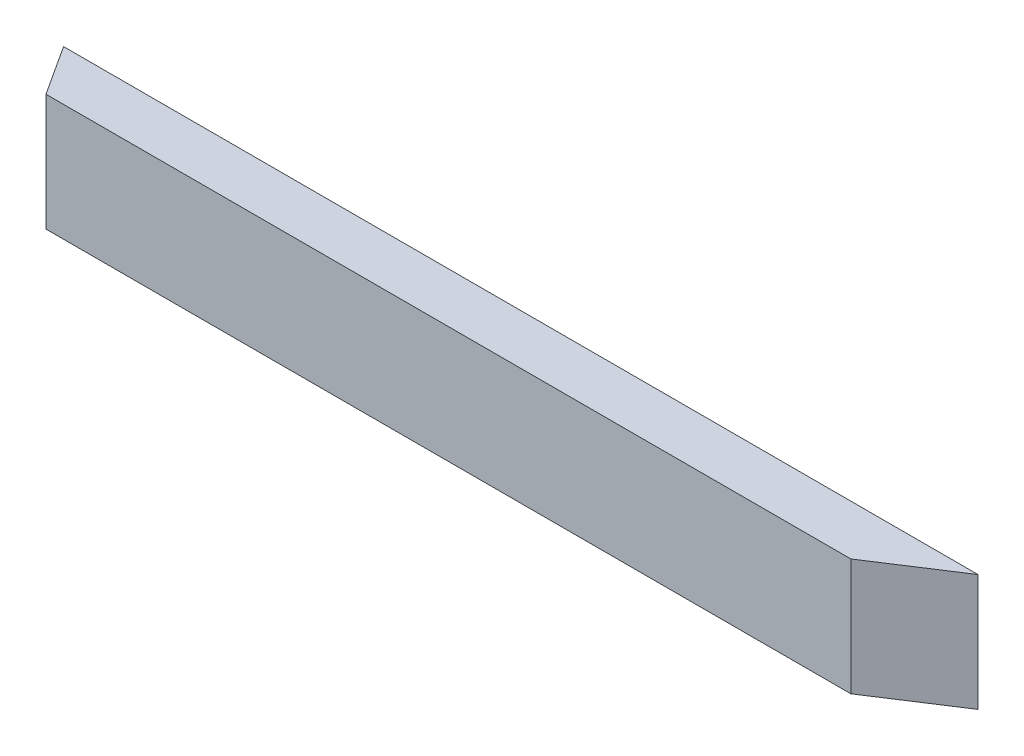
ISO-10303-21;
HEADER;
FILE_DESCRIPTION(('STEP AP214'),'2;1');
FILE_NAME('part.step','',(''),(''),'','','');
FILE_SCHEMA(('AUTOMOTIVE_DESIGN { 1 0 10303 214 1 1 1 1 }'));
ENDSEC;
DATA;
#1=APPLICATION_CONTEXT('core data for automotive mechanical design processes');
#2=APPLICATION_PROTOCOL_DEFINITION('international standard','automotive_design',2000,#1);
#3=PRODUCT_CONTEXT('',#1,'mechanical');
#4=PRODUCT('Part','Part','',(#3));
#5=PRODUCT_RELATED_PRODUCT_CATEGORY('part','',(#4));
#6=PRODUCT_DEFINITION_FORMATION('','',#4);
#7=PRODUCT_DEFINITION_CONTEXT('part definition',#1,'design');
#8=PRODUCT_DEFINITION('design','',#6,#7);
#9=PRODUCT_DEFINITION_SHAPE('','',#8);
#10=(LENGTH_UNIT() NAMED_UNIT(*) SI_UNIT(.MILLI.,.METRE.));
#11=(NAMED_UNIT(*) PLANE_ANGLE_UNIT() SI_UNIT($,.RADIAN.));
#12=(NAMED_UNIT(*) SI_UNIT($,.STERADIAN.) SOLID_ANGLE_UNIT());
#13=UNCERTAINTY_MEASURE_WITH_UNIT(LENGTH_MEASURE(1.E-05),#10,'distance_accuracy_value','');
#14=(GEOMETRIC_REPRESENTATION_CONTEXT(3) GLOBAL_UNCERTAINTY_ASSIGNED_CONTEXT((#13)) GLOBAL_UNIT_ASSIGNED_CONTEXT((#10,
#11,#12)) REPRESENTATION_CONTEXT('',''));
#15=CARTESIAN_POINT('',(0.,0.,0.));
#16=DIRECTION('',(0.,0.,1.));
#17=DIRECTION('',(1.,0.,0.));
#18=AXIS2_PLACEMENT_3D('',#15,#16,#17);
#19=CARTESIAN_POINT('',(24.7424293008255,88.9,38.1000000000001));
#20=DIRECTION('',(0.838670567945421,0.,-0.544639035015031));
#21=DIRECTION('',(-0.544639035015032,0.,-0.838670567945421));
#22=AXIS2_PLACEMENT_3D('',#19,#20,#21);
#23=PLANE('',#22);
#24=DIRECTION('',(0.544639035015032,0.,0.838670567945421));
#25=VECTOR('',#24,1.);
#26=CARTESIAN_POINT('',(24.7424293008255,0.,38.1000000000001));
#27=LINE('',#26,#25);
#28=CARTESIAN_POINT('',(0.,0.,0.));
#29=VERTEX_POINT('',#28);
#30=CARTESIAN_POINT('',(24.7424293008255,0.,38.1000000000001));
#31=VERTEX_POINT('',#30);
#32=EDGE_CURVE('E96',#29,#31,#27,.T.);
#33=ORIENTED_EDGE('',*,*,#32,.T.);
#34=DIRECTION('',(0.,-1.,0.));
#35=VECTOR('',#34,1.);
#36=CARTESIAN_POINT('',(24.7424293008255,88.9,38.1000000000001));
#37=LINE('',#36,#35);
#38=CARTESIAN_POINT('',(24.7424293008255,88.9,38.1000000000001));
#39=VERTEX_POINT('',#38);
#40=EDGE_CURVE('E11',#39,#31,#37,.T.);
#41=ORIENTED_EDGE('',*,*,#40,.F.);
#42=DIRECTION('',(0.544639035015032,0.,0.838670567945421));
#43=VECTOR('',#42,1.);
#44=CARTESIAN_POINT('',(24.7424293008255,88.9,38.1000000000001));
#45=LINE('',#44,#43);
#46=CARTESIAN_POINT('',(0.,88.9,0.));
#47=VERTEX_POINT('',#46);
#48=EDGE_CURVE('E84',#47,#39,#45,.T.);
#49=ORIENTED_EDGE('',*,*,#48,.F.);
#50=DIRECTION('',(0.,-1.,0.));
#51=VECTOR('',#50,1.);
#52=CARTESIAN_POINT('',(0.,88.9,0.));
#53=LINE('',#52,#51);
#54=EDGE_CURVE('E92',#47,#29,#53,.T.);
#55=ORIENTED_EDGE('',*,*,#54,.T.);
#56=EDGE_LOOP('',(#33,#41,#49,#55));
#57=FACE_BOUND('',#56,.T.);
#58=ADVANCED_FACE('F33',(#57),#23,.F.);
#59=CARTESIAN_POINT('',(637.291144878664,88.9,38.1));
#60=DIRECTION('',(0.,0.,-1.));
#61=DIRECTION('',(-1.,0.,0.));
#62=AXIS2_PLACEMENT_3D('',#59,#60,#61);
#63=PLANE('',#62);
#64=DIRECTION('',(1.,0.,0.));
#65=VECTOR('',#64,1.);
#66=CARTESIAN_POINT('',(637.291144878664,0.,38.1));
#67=LINE('',#66,#65);
#68=CARTESIAN_POINT('',(637.291144878664,0.,38.1));
#69=VERTEX_POINT('',#68);
#70=EDGE_CURVE('E88',#31,#69,#67,.T.);
#71=ORIENTED_EDGE('',*,*,#70,.T.);
#72=DIRECTION('',(0.,-1.,0.));
#73=VECTOR('',#72,1.);
#74=CARTESIAN_POINT('',(637.291144878664,88.9,38.1));
#75=LINE('',#74,#73);
#76=CARTESIAN_POINT('',(637.291144878664,88.9,38.1));
#77=VERTEX_POINT('',#76);
#78=EDGE_CURVE('E41',#77,#69,#75,.T.);
#79=ORIENTED_EDGE('',*,*,#78,.F.);
#80=DIRECTION('',(1.,0.,0.));
#81=VECTOR('',#80,1.);
#82=CARTESIAN_POINT('',(637.291144878664,88.9,38.1));
#83=LINE('',#82,#81);
#84=EDGE_CURVE('E79',#39,#77,#83,.T.);
#85=ORIENTED_EDGE('',*,*,#84,.F.);
#86=ORIENTED_EDGE('',*,*,#40,.T.);
#87=EDGE_LOOP('',(#71,#79,#85,#86));
#88=FACE_BOUND('',#87,.T.);
#89=ADVANCED_FACE('F87',(#88),#63,.F.);
#90=CARTESIAN_POINT('',(695.96,88.9,0.));
#91=DIRECTION('',(-0.544639035015022,0.,-0.838670567945427));
#92=DIRECTION('',(-0.838670567945427,0.,0.544639035015022));
#93=AXIS2_PLACEMENT_3D('',#90,#91,#92);
#94=PLANE('',#93);
#95=DIRECTION('',(0.838670567945427,0.,-0.544639035015022));
#96=VECTOR('',#95,1.);
#97=CARTESIAN_POINT('',(695.96,0.,0.));
#98=LINE('',#97,#96);
#99=CARTESIAN_POINT('',(695.96,0.,0.));
#100=VERTEX_POINT('',#99);
#101=EDGE_CURVE('E66',#69,#100,#98,.T.);
#102=ORIENTED_EDGE('',*,*,#101,.T.);
#103=DIRECTION('',(0.,-1.,0.));
#104=VECTOR('',#103,1.);
#105=CARTESIAN_POINT('',(695.96,88.9,0.));
#106=LINE('',#105,#104);
#107=CARTESIAN_POINT('',(695.96,88.9,0.));
#108=VERTEX_POINT('',#107);
#109=EDGE_CURVE('E89',#108,#100,#106,.T.);
#110=ORIENTED_EDGE('',*,*,#109,.F.);
#111=DIRECTION('',(0.838670567945427,0.,-0.544639035015022));
#112=VECTOR('',#111,1.);
#113=CARTESIAN_POINT('',(695.96,88.9,0.));
#114=LINE('',#113,#112);
#115=EDGE_CURVE('E82',#77,#108,#114,.T.);
#116=ORIENTED_EDGE('',*,*,#115,.F.);
#117=ORIENTED_EDGE('',*,*,#78,.T.);
#118=EDGE_LOOP('',(#102,#110,#116,#117));
#119=FACE_BOUND('',#118,.T.);
#120=ADVANCED_FACE('F90',(#119),#94,.F.);
#121=CARTESIAN_POINT('',(0.,88.9,0.));
#122=DIRECTION('',(0.,0.,1.));
#123=DIRECTION('',(1.,0.,0.));
#124=AXIS2_PLACEMENT_3D('',#121,#122,#123);
#125=PLANE('',#124);
#126=DIRECTION('',(-1.,0.,0.));
#127=VECTOR('',#126,1.);
#128=CARTESIAN_POINT('',(0.,0.,0.));
#129=LINE('',#128,#127);
#130=EDGE_CURVE('E72',#100,#29,#129,.T.);
#131=ORIENTED_EDGE('',*,*,#130,.T.);
#132=ORIENTED_EDGE('',*,*,#54,.F.);
#133=DIRECTION('',(-1.,0.,0.));
#134=VECTOR('',#133,1.);
#135=CARTESIAN_POINT('',(0.,88.9,0.));
#136=LINE('',#135,#134);
#137=EDGE_CURVE('E49',#108,#47,#136,.T.);
#138=ORIENTED_EDGE('',*,*,#137,.F.);
#139=ORIENTED_EDGE('',*,*,#109,.T.);
#140=EDGE_LOOP('',(#131,#132,#138,#139));
#141=FACE_BOUND('',#140,.T.);
#142=ADVANCED_FACE('F103',(#141),#125,.F.);
#143=CARTESIAN_POINT('',(0.,88.9,0.));
#144=DIRECTION('',(0.,1.,0.));
#145=DIRECTION('',(0.,0.,1.));
#146=AXIS2_PLACEMENT_3D('',#143,#144,#145);
#147=PLANE('',#146);
#148=ORIENTED_EDGE('',*,*,#48,.T.);
#149=ORIENTED_EDGE('',*,*,#84,.T.);
#150=ORIENTED_EDGE('',*,*,#115,.T.);
#151=ORIENTED_EDGE('',*,*,#137,.T.);
#152=EDGE_LOOP('',(#148,#149,#150,#151));
#153=FACE_BOUND('',#152,.T.);
#154=ADVANCED_FACE('F80',(#153),#147,.T.);
#155=CARTESIAN_POINT('',(0.,0.,0.));
#156=DIRECTION('',(0.,1.,0.));
#157=DIRECTION('',(0.,0.,1.));
#158=AXIS2_PLACEMENT_3D('',#155,#156,#157);
#159=PLANE('',#158);
#160=ORIENTED_EDGE('',*,*,#32,.F.);
#161=ORIENTED_EDGE('',*,*,#130,.F.);
#162=ORIENTED_EDGE('',*,*,#101,.F.);
#163=ORIENTED_EDGE('',*,*,#70,.F.);
#164=EDGE_LOOP('',(#160,#161,#162,#163));
#165=FACE_BOUND('',#164,.T.);
#166=ADVANCED_FACE('F106',(#165),#159,.F.);
#167=CLOSED_SHELL('',(#58,#89,#120,#142,#154,#166));
#168=MANIFOLD_SOLID_BREP('B2',#167);
#169=ADVANCED_BREP_SHAPE_REPRESENTATION('',(#18,#168),#14);
#170=SHAPE_DEFINITION_REPRESENTATION(#9,#169);
ENDSEC;
END-ISO-10303-21;
